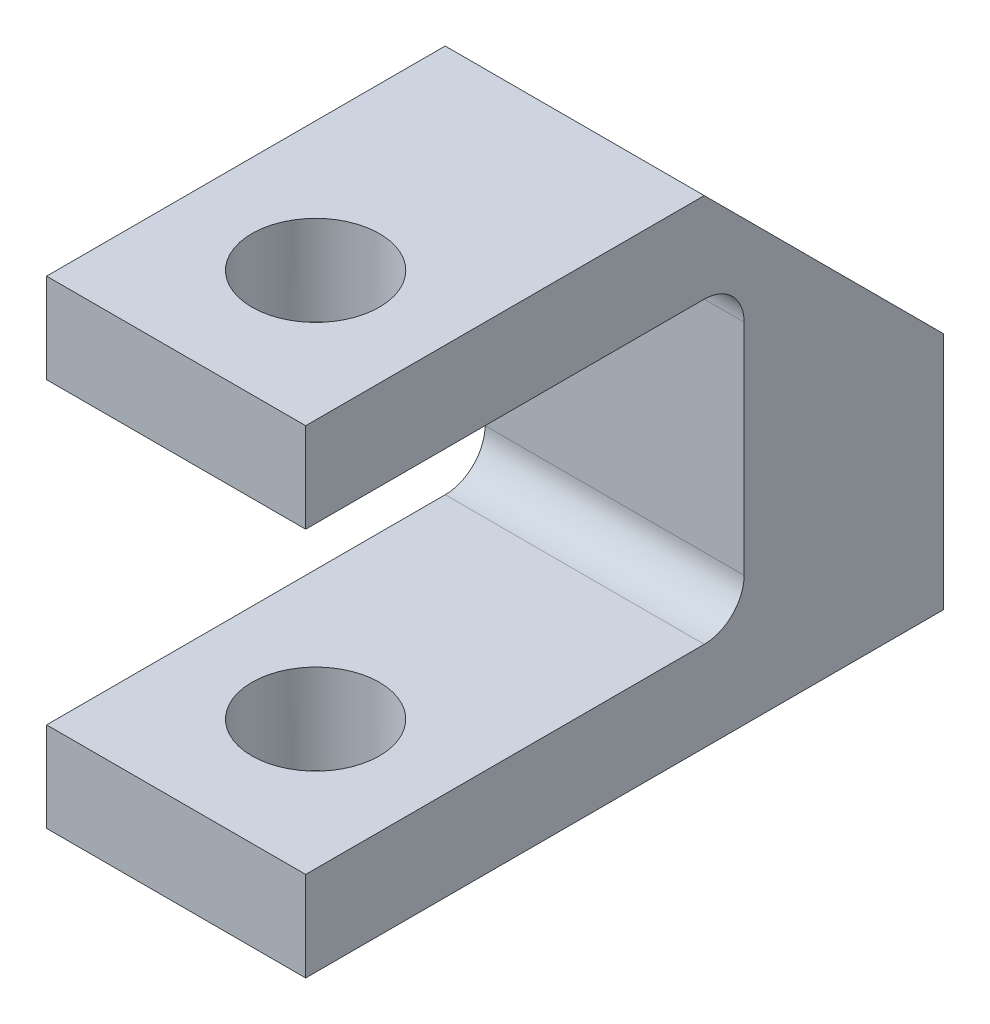
ISO-10303-21;
HEADER;
FILE_DESCRIPTION(('STEP AP214'),'2;1');
FILE_NAME('part.step','',(''),(''),'','','');
FILE_SCHEMA(('AUTOMOTIVE_DESIGN { 1 0 10303 214 1 1 1 1 }'));
ENDSEC;
DATA;
#1=APPLICATION_CONTEXT('core data for automotive mechanical design processes');
#2=APPLICATION_PROTOCOL_DEFINITION('international standard','automotive_design',2000,#1);
#3=PRODUCT_CONTEXT('',#1,'mechanical');
#4=PRODUCT('Part','Part','',(#3));
#5=PRODUCT_RELATED_PRODUCT_CATEGORY('part','',(#4));
#6=PRODUCT_DEFINITION_FORMATION('','',#4);
#7=PRODUCT_DEFINITION_CONTEXT('part definition',#1,'design');
#8=PRODUCT_DEFINITION('design','',#6,#7);
#9=PRODUCT_DEFINITION_SHAPE('','',#8);
#10=(LENGTH_UNIT() NAMED_UNIT(*) SI_UNIT(.MILLI.,.METRE.));
#11=(NAMED_UNIT(*) PLANE_ANGLE_UNIT() SI_UNIT($,.RADIAN.));
#12=(NAMED_UNIT(*) SI_UNIT($,.STERADIAN.) SOLID_ANGLE_UNIT());
#13=UNCERTAINTY_MEASURE_WITH_UNIT(LENGTH_MEASURE(1.E-05),#10,'distance_accuracy_value','');
#14=(GEOMETRIC_REPRESENTATION_CONTEXT(3) GLOBAL_UNCERTAINTY_ASSIGNED_CONTEXT((#13)) GLOBAL_UNIT_ASSIGNED_CONTEXT((#10,
#11,#12)) REPRESENTATION_CONTEXT('',''));
#15=CARTESIAN_POINT('',(0.,0.,0.));
#16=DIRECTION('',(0.,0.,1.));
#17=DIRECTION('',(1.,0.,0.));
#18=AXIS2_PLACEMENT_3D('',#15,#16,#17);
#19=CARTESIAN_POINT('',(-6.5,-6.,8.));
#20=DIRECTION('',(0.,0.,1.));
#21=DIRECTION('',(1.,0.,0.));
#22=AXIS2_PLACEMENT_3D('',#19,#20,#21);
#23=PLANE('',#22);
#24=DIRECTION('',(0.,-1.,0.));
#25=VECTOR('',#24,1.);
#26=CARTESIAN_POINT('',(-6.5,-6.,8.));
#27=LINE('',#26,#25);
#28=CARTESIAN_POINT('',(-6.5,6.,8.));
#29=VERTEX_POINT('',#28);
#30=CARTESIAN_POINT('',(-6.5,3.75,8.));
#31=VERTEX_POINT('',#30);
#32=EDGE_CURVE('E132',#29,#31,#27,.T.);
#33=ORIENTED_EDGE('',*,*,#32,.T.);
#34=DIRECTION('',(1.,0.,0.));
#35=VECTOR('',#34,1.);
#36=CARTESIAN_POINT('',(-10.25,3.75,8.));
#37=LINE('',#36,#35);
#38=CARTESIAN_POINT('',(0.,3.75,8.));
#39=VERTEX_POINT('',#38);
#40=EDGE_CURVE('E139',#31,#39,#37,.T.);
#41=ORIENTED_EDGE('',*,*,#40,.T.);
#42=DIRECTION('',(0.,-1.,0.));
#43=VECTOR('',#42,1.);
#44=CARTESIAN_POINT('',(0.,-6.,8.));
#45=LINE('',#44,#43);
#46=CARTESIAN_POINT('',(0.,6.,8.));
#47=VERTEX_POINT('',#46);
#48=EDGE_CURVE('E174',#47,#39,#45,.T.);
#49=ORIENTED_EDGE('',*,*,#48,.F.);
#50=DIRECTION('',(1.,0.,0.));
#51=VECTOR('',#50,1.);
#52=CARTESIAN_POINT('',(-6.5,6.,8.));
#53=LINE('',#52,#51);
#54=EDGE_CURVE('E152',#29,#47,#53,.T.);
#55=ORIENTED_EDGE('',*,*,#54,.F.);
#56=EDGE_LOOP('',(#33,#41,#49,#55));
#57=FACE_BOUND('',#56,.T.);
#58=ADVANCED_FACE('F45',(#57),#23,.T.);
#59=CARTESIAN_POINT('',(-6.5,0.,0.));
#60=DIRECTION('',(-1.,0.,0.));
#61=DIRECTION('',(0.,0.,1.));
#62=AXIS2_PLACEMENT_3D('',#59,#60,#61);
#63=PLANE('',#62);
#64=DIRECTION('',(0.,0.,1.));
#65=VECTOR('',#64,1.);
#66=CARTESIAN_POINT('',(-6.5,-3.75,0.));
#67=LINE('',#66,#65);
#68=CARTESIAN_POINT('',(-6.5,-3.75,-2.));
#69=VERTEX_POINT('',#68);
#70=CARTESIAN_POINT('',(-6.5,-3.75,8.));
#71=VERTEX_POINT('',#70);
#72=EDGE_CURVE('E136',#69,#71,#67,.T.);
#73=ORIENTED_EDGE('',*,*,#72,.F.);
#74=CARTESIAN_POINT('',(-6.5,-2.75,-2.));
#75=DIRECTION('',(-1.,0.,0.));
#76=DIRECTION('',(0.,0.,1.));
#77=AXIS2_PLACEMENT_3D('',#74,#75,#76);
#78=CIRCLE('',#77,1.);
#79=CARTESIAN_POINT('',(-6.5,-2.75,-3.));
#80=VERTEX_POINT('',#79);
#81=EDGE_CURVE('E221',#69,#80,#78,.F.);
#82=ORIENTED_EDGE('',*,*,#81,.T.);
#83=DIRECTION('',(0.,1.,0.));
#84=VECTOR('',#83,1.);
#85=CARTESIAN_POINT('',(-6.5,0.,-3.));
#86=LINE('',#85,#84);
#87=CARTESIAN_POINT('',(-6.5,2.75,-3.));
#88=VERTEX_POINT('',#87);
#89=EDGE_CURVE('E268',#80,#88,#86,.T.);
#90=ORIENTED_EDGE('',*,*,#89,.T.);
#91=CARTESIAN_POINT('',(-6.5,2.75,-2.));
#92=DIRECTION('',(-1.,0.,0.));
#93=DIRECTION('',(0.,0.,1.));
#94=AXIS2_PLACEMENT_3D('',#91,#92,#93);
#95=CIRCLE('',#94,1.);
#96=CARTESIAN_POINT('',(-6.5,3.75,-2.));
#97=VERTEX_POINT('',#96);
#98=EDGE_CURVE('E11',#88,#97,#95,.F.);
#99=ORIENTED_EDGE('',*,*,#98,.T.);
#100=DIRECTION('',(0.,0.,1.));
#101=VECTOR('',#100,1.);
#102=CARTESIAN_POINT('',(-6.5,3.75,0.));
#103=LINE('',#102,#101);
#104=EDGE_CURVE('E126',#97,#31,#103,.T.);
#105=ORIENTED_EDGE('',*,*,#104,.T.);
#106=ORIENTED_EDGE('',*,*,#32,.F.);
#107=DIRECTION('',(0.,0.,1.));
#108=VECTOR('',#107,1.);
#109=CARTESIAN_POINT('',(-6.5,6.,8.));
#110=LINE('',#109,#108);
#111=CARTESIAN_POINT('',(-6.5,6.,-2.));
#112=VERTEX_POINT('',#111);
#113=EDGE_CURVE('E161',#112,#29,#110,.T.);
#114=ORIENTED_EDGE('',*,*,#113,.F.);
#115=DIRECTION('',(0.,-0.707106781186548,-0.707106781186548));
#116=VECTOR('',#115,1.);
#117=CARTESIAN_POINT('',(-6.5,0.,-8.));
#118=LINE('',#117,#116);
#119=CARTESIAN_POINT('',(-6.5,0.,-8.));
#120=VERTEX_POINT('',#119);
#121=EDGE_CURVE('E286',#112,#120,#118,.T.);
#122=ORIENTED_EDGE('',*,*,#121,.T.);
#123=DIRECTION('',(0.,1.,0.));
#124=VECTOR('',#123,1.);
#125=CARTESIAN_POINT('',(-6.5,-6.,-8.));
#126=LINE('',#125,#124);
#127=CARTESIAN_POINT('',(-6.5,-6.,-8.));
#128=VERTEX_POINT('',#127);
#129=EDGE_CURVE('E181',#128,#120,#126,.T.);
#130=ORIENTED_EDGE('',*,*,#129,.F.);
#131=DIRECTION('',(0.,0.,-1.));
#132=VECTOR('',#131,1.);
#133=CARTESIAN_POINT('',(-6.5,-6.,8.));
#134=LINE('',#133,#132);
#135=CARTESIAN_POINT('',(-6.5,-6.,8.));
#136=VERTEX_POINT('',#135);
#137=EDGE_CURVE('E154',#136,#128,#134,.T.);
#138=ORIENTED_EDGE('',*,*,#137,.F.);
#139=EDGE_CURVE('E155',#71,#136,#27,.T.);
#140=ORIENTED_EDGE('',*,*,#139,.F.);
#141=EDGE_LOOP('',(#73,#82,#90,#99,#105,#106,#114,#122,#130,#138,#140));
#142=FACE_BOUND('',#141,.T.);
#143=ADVANCED_FACE('F129',(#142),#63,.T.);
#144=CARTESIAN_POINT('',(0.,0.,0.));
#145=DIRECTION('',(-1.,0.,0.));
#146=DIRECTION('',(0.,0.,1.));
#147=AXIS2_PLACEMENT_3D('',#144,#145,#146);
#148=PLANE('',#147);
#149=DIRECTION('',(0.,0.,1.));
#150=VECTOR('',#149,1.);
#151=CARTESIAN_POINT('',(0.,3.75,0.));
#152=LINE('',#151,#150);
#153=CARTESIAN_POINT('',(0.,3.75,-2.));
#154=VERTEX_POINT('',#153);
#155=EDGE_CURVE('E142',#154,#39,#152,.T.);
#156=ORIENTED_EDGE('',*,*,#155,.F.);
#157=CARTESIAN_POINT('',(0.,2.75,-2.));
#158=DIRECTION('',(-1.,0.,0.));
#159=DIRECTION('',(0.,0.,1.));
#160=AXIS2_PLACEMENT_3D('',#157,#158,#159);
#161=CIRCLE('',#160,1.);
#162=CARTESIAN_POINT('',(0.,2.75,-3.));
#163=VERTEX_POINT('',#162);
#164=EDGE_CURVE('E54',#154,#163,#161,.T.);
#165=ORIENTED_EDGE('',*,*,#164,.T.);
#166=DIRECTION('',(0.,1.,0.));
#167=VECTOR('',#166,1.);
#168=CARTESIAN_POINT('',(0.,0.,-3.));
#169=LINE('',#168,#167);
#170=CARTESIAN_POINT('',(0.,-2.75,-3.));
#171=VERTEX_POINT('',#170);
#172=EDGE_CURVE('E185',#171,#163,#169,.T.);
#173=ORIENTED_EDGE('',*,*,#172,.F.);
#174=CARTESIAN_POINT('',(0.,-2.75,-2.));
#175=DIRECTION('',(-1.,0.,0.));
#176=DIRECTION('',(0.,0.,1.));
#177=AXIS2_PLACEMENT_3D('',#174,#175,#176);
#178=CIRCLE('',#177,1.);
#179=CARTESIAN_POINT('',(0.,-3.75,-2.));
#180=VERTEX_POINT('',#179);
#181=EDGE_CURVE('E218',#171,#180,#178,.T.);
#182=ORIENTED_EDGE('',*,*,#181,.T.);
#183=DIRECTION('',(0.,0.,1.));
#184=VECTOR('',#183,1.);
#185=CARTESIAN_POINT('',(0.,-3.75,0.));
#186=LINE('',#185,#184);
#187=CARTESIAN_POINT('',(0.,-3.75,8.));
#188=VERTEX_POINT('',#187);
#189=EDGE_CURVE('E195',#180,#188,#186,.T.);
#190=ORIENTED_EDGE('',*,*,#189,.T.);
#191=CARTESIAN_POINT('',(0.,-6.,8.));
#192=VERTEX_POINT('',#191);
#193=EDGE_CURVE('E173',#188,#192,#45,.T.);
#194=ORIENTED_EDGE('',*,*,#193,.T.);
#195=DIRECTION('',(0.,0.,-1.));
#196=VECTOR('',#195,1.);
#197=CARTESIAN_POINT('',(0.,-6.,8.));
#198=LINE('',#197,#196);
#199=CARTESIAN_POINT('',(0.,-6.,-8.));
#200=VERTEX_POINT('',#199);
#201=EDGE_CURVE('E177',#192,#200,#198,.T.);
#202=ORIENTED_EDGE('',*,*,#201,.T.);
#203=DIRECTION('',(0.,1.,0.));
#204=VECTOR('',#203,1.);
#205=CARTESIAN_POINT('',(0.,-6.,-8.));
#206=LINE('',#205,#204);
#207=CARTESIAN_POINT('',(0.,0.,-8.));
#208=VERTEX_POINT('',#207);
#209=EDGE_CURVE('E165',#200,#208,#206,.T.);
#210=ORIENTED_EDGE('',*,*,#209,.T.);
#211=DIRECTION('',(0.,-0.707106781186548,-0.707106781186548));
#212=VECTOR('',#211,1.);
#213=CARTESIAN_POINT('',(0.,0.,-8.));
#214=LINE('',#213,#212);
#215=CARTESIAN_POINT('',(0.,6.,-2.));
#216=VERTEX_POINT('',#215);
#217=EDGE_CURVE('E135',#216,#208,#214,.T.);
#218=ORIENTED_EDGE('',*,*,#217,.F.);
#219=DIRECTION('',(0.,0.,1.));
#220=VECTOR('',#219,1.);
#221=CARTESIAN_POINT('',(0.,6.,8.));
#222=LINE('',#221,#220);
#223=EDGE_CURVE('E169',#216,#47,#222,.T.);
#224=ORIENTED_EDGE('',*,*,#223,.T.);
#225=ORIENTED_EDGE('',*,*,#48,.T.);
#226=EDGE_LOOP('',(#156,#165,#173,#182,#190,#194,#202,#210,#218,#224,#225));
#227=FACE_BOUND('',#226,.T.);
#228=ADVANCED_FACE('F226',(#227),#148,.F.);
#229=CARTESIAN_POINT('',(-6.5,-6.,-8.));
#230=DIRECTION('',(0.,0.,-1.));
#231=DIRECTION('',(-1.,0.,0.));
#232=AXIS2_PLACEMENT_3D('',#229,#230,#231);
#233=PLANE('',#232);
#234=DIRECTION('',(1.,0.,0.));
#235=VECTOR('',#234,1.);
#236=CARTESIAN_POINT('',(-6.5,0.,-8.));
#237=LINE('',#236,#235);
#238=EDGE_CURVE('E170',#120,#208,#237,.T.);
#239=ORIENTED_EDGE('',*,*,#238,.T.);
#240=ORIENTED_EDGE('',*,*,#209,.F.);
#241=DIRECTION('',(1.,0.,0.));
#242=VECTOR('',#241,1.);
#243=CARTESIAN_POINT('',(-6.5,-6.,-8.));
#244=LINE('',#243,#242);
#245=EDGE_CURVE('E182',#128,#200,#244,.T.);
#246=ORIENTED_EDGE('',*,*,#245,.F.);
#247=ORIENTED_EDGE('',*,*,#129,.T.);
#248=EDGE_LOOP('',(#239,#240,#246,#247));
#249=FACE_BOUND('',#248,.T.);
#250=ADVANCED_FACE('F258',(#249),#233,.T.);
#251=CARTESIAN_POINT('',(-6.5,-6.,8.));
#252=DIRECTION('',(0.,-1.,0.));
#253=DIRECTION('',(0.,0.,-1.));
#254=AXIS2_PLACEMENT_3D('',#251,#252,#253);
#255=PLANE('',#254);
#256=CARTESIAN_POINT('',(-3.25,-6.,4.5));
#257=DIRECTION('',(0.,1.,0.));
#258=DIRECTION('',(0.,0.,1.));
#259=AXIS2_PLACEMENT_3D('',#256,#257,#258);
#260=CIRCLE('',#259,1.6);
#261=CARTESIAN_POINT('',(-3.25,-6.,6.1));
#262=VERTEX_POINT('',#261);
#263=EDGE_CURVE('E205',#262,#262,#260,.T.);
#264=ORIENTED_EDGE('',*,*,#263,.T.);
#265=EDGE_LOOP('',(#264));
#266=FACE_BOUND('',#265,.T.);
#267=ORIENTED_EDGE('',*,*,#201,.F.);
#268=DIRECTION('',(1.,0.,0.));
#269=VECTOR('',#268,1.);
#270=CARTESIAN_POINT('',(-6.5,-6.,8.));
#271=LINE('',#270,#269);
#272=EDGE_CURVE('E186',#136,#192,#271,.T.);
#273=ORIENTED_EDGE('',*,*,#272,.F.);
#274=ORIENTED_EDGE('',*,*,#137,.T.);
#275=ORIENTED_EDGE('',*,*,#245,.T.);
#276=EDGE_LOOP('',(#267,#273,#274,#275));
#277=FACE_BOUND('',#276,.T.);
#278=ADVANCED_FACE('F250',(#266,#277),#255,.T.);
#279=DIRECTION('',(1.,0.,0.));
#280=VECTOR('',#279,1.);
#281=CARTESIAN_POINT('',(-10.25,-3.75,8.));
#282=LINE('',#281,#280);
#283=EDGE_CURVE('E147',#71,#188,#282,.T.);
#284=ORIENTED_EDGE('',*,*,#283,.F.);
#285=ORIENTED_EDGE('',*,*,#139,.T.);
#286=ORIENTED_EDGE('',*,*,#272,.T.);
#287=ORIENTED_EDGE('',*,*,#193,.F.);
#288=EDGE_LOOP('',(#284,#285,#286,#287));
#289=FACE_BOUND('',#288,.T.);
#290=ADVANCED_FACE('F240',(#289),#23,.T.);
#291=CARTESIAN_POINT('',(-6.5,6.,8.));
#292=DIRECTION('',(0.,1.,0.));
#293=DIRECTION('',(0.,0.,1.));
#294=AXIS2_PLACEMENT_3D('',#291,#292,#293);
#295=PLANE('',#294);
#296=CARTESIAN_POINT('',(-3.25,6.,4.5));
#297=DIRECTION('',(0.,1.,0.));
#298=DIRECTION('',(0.,0.,1.));
#299=AXIS2_PLACEMENT_3D('',#296,#297,#298);
#300=CIRCLE('',#299,1.6);
#301=CARTESIAN_POINT('',(-3.25,6.,6.1));
#302=VERTEX_POINT('',#301);
#303=EDGE_CURVE('E301',#302,#302,#300,.T.);
#304=ORIENTED_EDGE('',*,*,#303,.F.);
#305=EDGE_LOOP('',(#304));
#306=FACE_BOUND('',#305,.T.);
#307=DIRECTION('',(1.,0.,0.));
#308=VECTOR('',#307,1.);
#309=CARTESIAN_POINT('',(-6.5,6.,-2.));
#310=LINE('',#309,#308);
#311=EDGE_CURVE('E283',#112,#216,#310,.T.);
#312=ORIENTED_EDGE('',*,*,#311,.F.);
#313=ORIENTED_EDGE('',*,*,#113,.T.);
#314=ORIENTED_EDGE('',*,*,#54,.T.);
#315=ORIENTED_EDGE('',*,*,#223,.F.);
#316=EDGE_LOOP('',(#312,#313,#314,#315));
#317=FACE_BOUND('',#316,.T.);
#318=ADVANCED_FACE('F249',(#306,#317),#295,.T.);
#319=CARTESIAN_POINT('',(-6.5,0.,-8.));
#320=DIRECTION('',(0.,-0.707106781186548,0.707106781186548));
#321=DIRECTION('',(0.,-0.707106781186548,-0.707106781186548));
#322=AXIS2_PLACEMENT_3D('',#319,#320,#321);
#323=PLANE('',#322);
#324=ORIENTED_EDGE('',*,*,#217,.T.);
#325=ORIENTED_EDGE('',*,*,#238,.F.);
#326=ORIENTED_EDGE('',*,*,#121,.F.);
#327=ORIENTED_EDGE('',*,*,#311,.T.);
#328=EDGE_LOOP('',(#324,#325,#326,#327));
#329=FACE_BOUND('',#328,.T.);
#330=ADVANCED_FACE('F256',(#329),#323,.F.);
#331=CARTESIAN_POINT('',(-10.25,3.75,-3.));
#332=DIRECTION('',(0.,-1.,0.));
#333=DIRECTION('',(0.,0.,-1.));
#334=AXIS2_PLACEMENT_3D('',#331,#332,#333);
#335=PLANE('',#334);
#336=CARTESIAN_POINT('',(-3.25,3.75,4.5));
#337=DIRECTION('',(0.,-1.,0.));
#338=DIRECTION('',(0.,0.,-1.));
#339=AXIS2_PLACEMENT_3D('',#336,#337,#338);
#340=CIRCLE('',#339,1.6);
#341=CARTESIAN_POINT('',(-3.25,3.75,2.9));
#342=VERTEX_POINT('',#341);
#343=EDGE_CURVE('E148',#342,#342,#340,.T.);
#344=ORIENTED_EDGE('',*,*,#343,.F.);
#345=EDGE_LOOP('',(#344));
#346=FACE_BOUND('',#345,.T.);
#347=ORIENTED_EDGE('',*,*,#104,.F.);
#348=DIRECTION('',(1.,0.,0.));
#349=VECTOR('',#348,1.);
#350=CARTESIAN_POINT('',(0.,3.75,-2.));
#351=LINE('',#350,#349);
#352=EDGE_CURVE('E215',#97,#154,#351,.T.);
#353=ORIENTED_EDGE('',*,*,#352,.T.);
#354=ORIENTED_EDGE('',*,*,#155,.T.);
#355=ORIENTED_EDGE('',*,*,#40,.F.);
#356=EDGE_LOOP('',(#347,#353,#354,#355));
#357=FACE_BOUND('',#356,.T.);
#358=ADVANCED_FACE('F140',(#346,#357),#335,.T.);
#359=CARTESIAN_POINT('',(-10.25,-3.75,-3.));
#360=DIRECTION('',(0.,-1.,0.));
#361=DIRECTION('',(0.,0.,-1.));
#362=AXIS2_PLACEMENT_3D('',#359,#360,#361);
#363=PLANE('',#362);
#364=CARTESIAN_POINT('',(-3.25,-3.75,4.5));
#365=DIRECTION('',(0.,-1.,0.));
#366=DIRECTION('',(0.,0.,-1.));
#367=AXIS2_PLACEMENT_3D('',#364,#365,#366);
#368=CIRCLE('',#367,1.6);
#369=CARTESIAN_POINT('',(-3.25,-3.75,2.9));
#370=VERTEX_POINT('',#369);
#371=EDGE_CURVE('E201',#370,#370,#368,.T.);
#372=ORIENTED_EDGE('',*,*,#371,.T.);
#373=EDGE_LOOP('',(#372));
#374=FACE_BOUND('',#373,.T.);
#375=ORIENTED_EDGE('',*,*,#189,.F.);
#376=DIRECTION('',(1.,0.,0.));
#377=VECTOR('',#376,1.);
#378=CARTESIAN_POINT('',(-10.25,-3.75,-2.));
#379=LINE('',#378,#377);
#380=EDGE_CURVE('E212',#180,#69,#379,.F.);
#381=ORIENTED_EDGE('',*,*,#380,.T.);
#382=ORIENTED_EDGE('',*,*,#72,.T.);
#383=ORIENTED_EDGE('',*,*,#283,.T.);
#384=EDGE_LOOP('',(#375,#381,#382,#383));
#385=FACE_BOUND('',#384,.T.);
#386=ADVANCED_FACE('F326',(#374,#385),#363,.F.);
#387=CARTESIAN_POINT('',(0.,0.,-3.));
#388=DIRECTION('',(0.,0.,1.));
#389=DIRECTION('',(1.,0.,0.));
#390=AXIS2_PLACEMENT_3D('',#387,#388,#389);
#391=PLANE('',#390);
#392=ORIENTED_EDGE('',*,*,#89,.F.);
#393=DIRECTION('',(1.,0.,0.));
#394=VECTOR('',#393,1.);
#395=CARTESIAN_POINT('',(0.,-2.75,-3.));
#396=LINE('',#395,#394);
#397=EDGE_CURVE('E208',#80,#171,#396,.T.);
#398=ORIENTED_EDGE('',*,*,#397,.T.);
#399=ORIENTED_EDGE('',*,*,#172,.T.);
#400=DIRECTION('',(1.,0.,0.));
#401=VECTOR('',#400,1.);
#402=CARTESIAN_POINT('',(-6.5,2.75,-3.));
#403=LINE('',#402,#401);
#404=EDGE_CURVE('E200',#163,#88,#403,.F.);
#405=ORIENTED_EDGE('',*,*,#404,.T.);
#406=EDGE_LOOP('',(#392,#398,#399,#405));
#407=FACE_BOUND('',#406,.T.);
#408=ADVANCED_FACE('F229',(#407),#391,.T.);
#409=CARTESIAN_POINT('',(-3.25,-6.,4.5));
#410=DIRECTION('',(0.,1.,0.));
#411=DIRECTION('',(0.,0.,1.));
#412=AXIS2_PLACEMENT_3D('',#409,#410,#411);
#413=CYLINDRICAL_SURFACE('',#412,1.6);
#414=ORIENTED_EDGE('',*,*,#263,.F.);
#415=EDGE_LOOP('',(#414));
#416=FACE_BOUND('',#415,.T.);
#417=ORIENTED_EDGE('',*,*,#371,.F.);
#418=EDGE_LOOP('',(#417));
#419=FACE_BOUND('',#418,.T.);
#420=ADVANCED_FACE('F333',(#416,#419),#413,.F.);
#421=ORIENTED_EDGE('',*,*,#343,.T.);
#422=EDGE_LOOP('',(#421));
#423=FACE_BOUND('',#422,.T.);
#424=ORIENTED_EDGE('',*,*,#303,.T.);
#425=EDGE_LOOP('',(#424));
#426=FACE_BOUND('',#425,.T.);
#427=ADVANCED_FACE('F236',(#423,#426),#413,.F.);
#428=CARTESIAN_POINT('',(0.,-2.75,-2.));
#429=DIRECTION('',(1.,0.,0.));
#430=DIRECTION('',(0.,0.,-1.));
#431=AXIS2_PLACEMENT_3D('',#428,#429,#430);
#432=CYLINDRICAL_SURFACE('',#431,1.);
#433=ORIENTED_EDGE('',*,*,#81,.F.);
#434=ORIENTED_EDGE('',*,*,#380,.F.);
#435=ORIENTED_EDGE('',*,*,#181,.F.);
#436=ORIENTED_EDGE('',*,*,#397,.F.);
#437=EDGE_LOOP('',(#433,#434,#435,#436));
#438=FACE_BOUND('',#437,.T.);
#439=ADVANCED_FACE('F232',(#438),#432,.F.);
#440=CARTESIAN_POINT('',(-10.25,2.75,-2.));
#441=DIRECTION('',(-1.,0.,0.));
#442=DIRECTION('',(0.,0.,1.));
#443=AXIS2_PLACEMENT_3D('',#440,#441,#442);
#444=CYLINDRICAL_SURFACE('',#443,1.);
#445=ORIENTED_EDGE('',*,*,#98,.F.);
#446=ORIENTED_EDGE('',*,*,#404,.F.);
#447=ORIENTED_EDGE('',*,*,#164,.F.);
#448=ORIENTED_EDGE('',*,*,#352,.F.);
#449=EDGE_LOOP('',(#445,#446,#447,#448));
#450=FACE_BOUND('',#449,.T.);
#451=ADVANCED_FACE('F47',(#450),#444,.F.);
#452=CLOSED_SHELL('',(#58,#143,#228,#250,#278,#290,#318,#330,#358,#386,#408,#420,#427,#439,#451));
#453=MANIFOLD_SOLID_BREP('B2',#452);
#454=ADVANCED_BREP_SHAPE_REPRESENTATION('',(#18,#453),#14);
#455=SHAPE_DEFINITION_REPRESENTATION(#9,#454);
ENDSEC;
END-ISO-10303-21;
